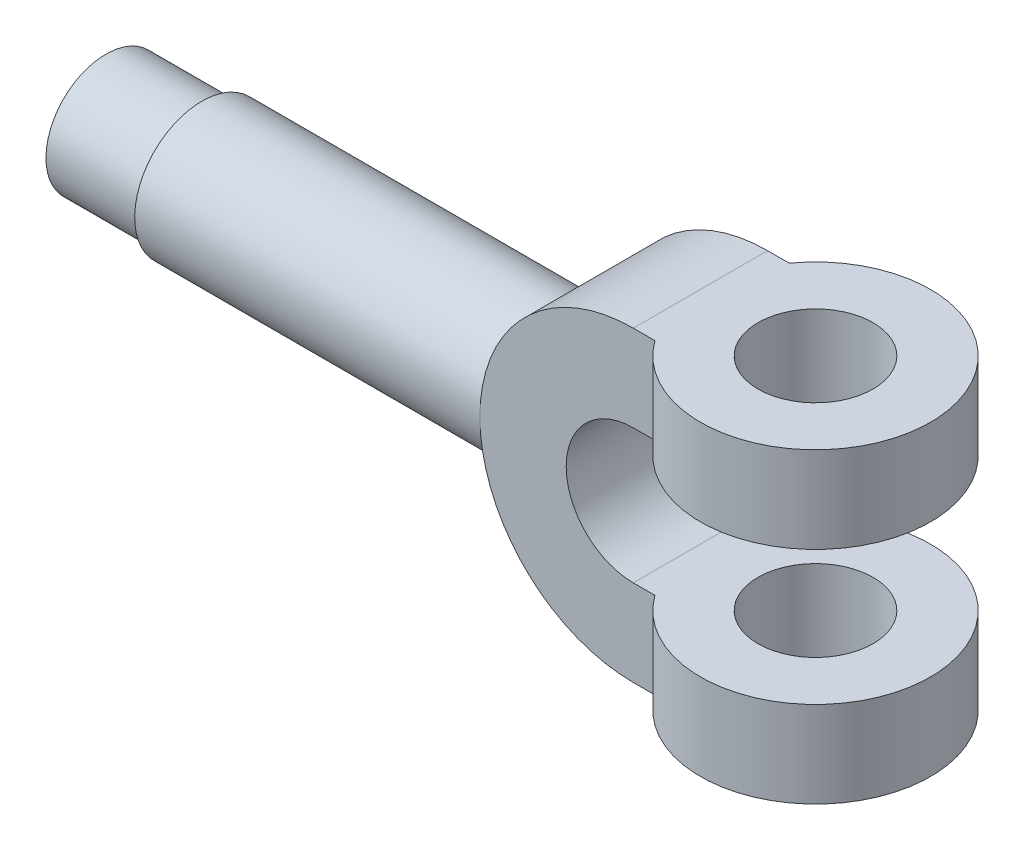
ISO-10303-21;
HEADER;
FILE_DESCRIPTION(('STEP AP214'),'2;1');
FILE_NAME('part.step','',(''),(''),'','','');
FILE_SCHEMA(('AUTOMOTIVE_DESIGN { 1 0 10303 214 1 1 1 1 }'));
ENDSEC;
DATA;
#1=APPLICATION_CONTEXT('core data for automotive mechanical design processes');
#2=APPLICATION_PROTOCOL_DEFINITION('international standard','automotive_design',2000,#1);
#3=PRODUCT_CONTEXT('',#1,'mechanical');
#4=PRODUCT('Part','Part','',(#3));
#5=PRODUCT_RELATED_PRODUCT_CATEGORY('part','',(#4));
#6=PRODUCT_DEFINITION_FORMATION('','',#4);
#7=PRODUCT_DEFINITION_CONTEXT('part definition',#1,'design');
#8=PRODUCT_DEFINITION('design','',#6,#7);
#9=PRODUCT_DEFINITION_SHAPE('','',#8);
#10=(LENGTH_UNIT() NAMED_UNIT(*) SI_UNIT(.MILLI.,.METRE.));
#11=(NAMED_UNIT(*) PLANE_ANGLE_UNIT() SI_UNIT($,.RADIAN.));
#12=(NAMED_UNIT(*) SI_UNIT($,.STERADIAN.) SOLID_ANGLE_UNIT());
#13=UNCERTAINTY_MEASURE_WITH_UNIT(LENGTH_MEASURE(1.E-05),#10,'distance_accuracy_value','');
#14=(GEOMETRIC_REPRESENTATION_CONTEXT(3) GLOBAL_UNCERTAINTY_ASSIGNED_CONTEXT((#13)) GLOBAL_UNIT_ASSIGNED_CONTEXT((#10,
#11,#12)) REPRESENTATION_CONTEXT('',''));
#15=CARTESIAN_POINT('',(0.,0.,0.));
#16=DIRECTION('',(0.,0.,1.));
#17=DIRECTION('',(1.,0.,0.));
#18=AXIS2_PLACEMENT_3D('',#15,#16,#17);
#19=CARTESIAN_POINT('',(0.,18.,0.));
#20=DIRECTION('',(0.,-1.,0.));
#21=DIRECTION('',(0.,0.,-1.));
#22=AXIS2_PLACEMENT_3D('',#19,#20,#21);
#23=CYLINDRICAL_SURFACE('',#22,24.);
#24=DIRECTION('',(0.,-1.,0.));
#25=VECTOR('',#24,1.);
#26=CARTESIAN_POINT('',(-19.4935886896179,18.,-14.));
#27=LINE('',#26,#25);
#28=CARTESIAN_POINT('',(-19.4935886896179,18.,-14.));
#29=VERTEX_POINT('',#28);
#30=CARTESIAN_POINT('',(-19.493588689618,0.,-13.9999999999999));
#31=VERTEX_POINT('',#30);
#32=EDGE_CURVE('E128',#29,#31,#27,.T.);
#33=ORIENTED_EDGE('',*,*,#32,.F.);
#34=CARTESIAN_POINT('',(0.,18.,0.));
#35=DIRECTION('',(0.,1.,0.));
#36=DIRECTION('',(0.,0.,1.));
#37=AXIS2_PLACEMENT_3D('',#34,#35,#36);
#38=CIRCLE('',#37,24.);
#39=CARTESIAN_POINT('',(-19.4935886896179,18.,14.));
#40=VERTEX_POINT('',#39);
#41=EDGE_CURVE('E13',#40,#29,#38,.T.);
#42=ORIENTED_EDGE('',*,*,#41,.F.);
#43=DIRECTION('',(0.,-1.,0.));
#44=VECTOR('',#43,1.);
#45=CARTESIAN_POINT('',(-19.4935886896179,18.,14.));
#46=LINE('',#45,#44);
#47=CARTESIAN_POINT('',(-19.493588689618,0.,14.0000000000001));
#48=VERTEX_POINT('',#47);
#49=EDGE_CURVE('E150',#40,#48,#46,.T.);
#50=ORIENTED_EDGE('',*,*,#49,.T.);
#51=CARTESIAN_POINT('',(0.,0.,0.));
#52=DIRECTION('',(0.,1.,0.));
#53=DIRECTION('',(0.,0.,1.));
#54=AXIS2_PLACEMENT_3D('',#51,#52,#53);
#55=CIRCLE('',#54,24.);
#56=EDGE_CURVE('E55',#48,#31,#55,.T.);
#57=ORIENTED_EDGE('',*,*,#56,.T.);
#58=EDGE_LOOP('',(#33,#42,#50,#57));
#59=FACE_BOUND('',#58,.T.);
#60=ADVANCED_FACE('F52',(#59),#23,.T.);
#61=CARTESIAN_POINT('',(0.,18.,0.));
#62=DIRECTION('',(0.,1.,0.));
#63=DIRECTION('',(0.,0.,1.));
#64=AXIS2_PLACEMENT_3D('',#61,#62,#63);
#65=PLANE('',#64);
#66=ORIENTED_EDGE('',*,*,#41,.T.);
#67=DIRECTION('',(-1.,0.,0.));
#68=VECTOR('',#67,1.);
#69=CARTESIAN_POINT('',(-24.0000000000001,18.,-14.));
#70=LINE('',#69,#68);
#71=CARTESIAN_POINT('',(-24.,18.,-13.9999999999999));
#72=VERTEX_POINT('',#71);
#73=EDGE_CURVE('E124',#29,#72,#70,.T.);
#74=ORIENTED_EDGE('',*,*,#73,.T.);
#75=DIRECTION('',(0.,0.,-1.));
#76=VECTOR('',#75,1.);
#77=CARTESIAN_POINT('',(-24.0000000000001,18.,14.0000000000001));
#78=LINE('',#77,#76);
#79=CARTESIAN_POINT('',(-24.,18.,14.0000000000001));
#80=VERTEX_POINT('',#79);
#81=EDGE_CURVE('E146',#80,#72,#78,.T.);
#82=ORIENTED_EDGE('',*,*,#81,.F.);
#83=DIRECTION('',(-1.,0.,0.));
#84=VECTOR('',#83,1.);
#85=CARTESIAN_POINT('',(-24.0000000000001,18.,14.0000000000001));
#86=LINE('',#85,#84);
#87=EDGE_CURVE('E145',#40,#80,#86,.T.);
#88=ORIENTED_EDGE('',*,*,#87,.F.);
#89=EDGE_LOOP('',(#66,#74,#82,#88));
#90=FACE_BOUND('',#89,.T.);
#91=CARTESIAN_POINT('',(0.,18.,0.));
#92=DIRECTION('',(0.,1.,0.));
#93=DIRECTION('',(0.,0.,1.));
#94=AXIS2_PLACEMENT_3D('',#91,#92,#93);
#95=CIRCLE('',#94,12.);
#96=CARTESIAN_POINT('',(0.,18.,12.));
#97=VERTEX_POINT('',#96);
#98=EDGE_CURVE('E167',#97,#97,#95,.T.);
#99=ORIENTED_EDGE('',*,*,#98,.F.);
#100=EDGE_LOOP('',(#99));
#101=FACE_BOUND('',#100,.T.);
#102=ADVANCED_FACE('F142',(#90,#101),#65,.T.);
#103=CARTESIAN_POINT('',(0.,0.,0.));
#104=DIRECTION('',(0.,1.,0.));
#105=DIRECTION('',(0.,0.,1.));
#106=AXIS2_PLACEMENT_3D('',#103,#104,#105);
#107=PLANE('',#106);
#108=ORIENTED_EDGE('',*,*,#56,.F.);
#109=DIRECTION('',(-1.,0.,0.));
#110=VECTOR('',#109,1.);
#111=CARTESIAN_POINT('',(-24.,0.,14.));
#112=LINE('',#111,#110);
#113=CARTESIAN_POINT('',(-24.,0.,14.));
#114=VERTEX_POINT('',#113);
#115=EDGE_CURVE('E157',#48,#114,#112,.T.);
#116=ORIENTED_EDGE('',*,*,#115,.T.);
#117=DIRECTION('',(0.,0.,-1.));
#118=VECTOR('',#117,1.);
#119=CARTESIAN_POINT('',(-24.,0.,14.));
#120=LINE('',#119,#118);
#121=CARTESIAN_POINT('',(-24.,0.,-14.));
#122=VERTEX_POINT('',#121);
#123=EDGE_CURVE('E73',#114,#122,#120,.T.);
#124=ORIENTED_EDGE('',*,*,#123,.T.);
#125=DIRECTION('',(-1.,0.,0.));
#126=VECTOR('',#125,1.);
#127=CARTESIAN_POINT('',(-24.,0.,-14.));
#128=LINE('',#127,#126);
#129=EDGE_CURVE('E135',#31,#122,#128,.T.);
#130=ORIENTED_EDGE('',*,*,#129,.F.);
#131=EDGE_LOOP('',(#108,#116,#124,#130));
#132=FACE_BOUND('',#131,.T.);
#133=CARTESIAN_POINT('',(0.,0.,0.));
#134=DIRECTION('',(0.,1.,0.));
#135=DIRECTION('',(0.,0.,1.));
#136=AXIS2_PLACEMENT_3D('',#133,#134,#135);
#137=CIRCLE('',#136,12.);
#138=CARTESIAN_POINT('',(0.,0.,12.));
#139=VERTEX_POINT('',#138);
#140=EDGE_CURVE('E155',#139,#139,#137,.T.);
#141=ORIENTED_EDGE('',*,*,#140,.T.);
#142=EDGE_LOOP('',(#141));
#143=FACE_BOUND('',#142,.T.);
#144=ADVANCED_FACE('F176',(#132,#143),#107,.F.);
#145=CARTESIAN_POINT('',(0.,18.,0.));
#146=DIRECTION('',(0.,-1.,0.));
#147=DIRECTION('',(0.,0.,-1.));
#148=AXIS2_PLACEMENT_3D('',#145,#146,#147);
#149=CYLINDRICAL_SURFACE('',#148,12.);
#150=ORIENTED_EDGE('',*,*,#98,.T.);
#151=EDGE_LOOP('',(#150));
#152=FACE_BOUND('',#151,.T.);
#153=ORIENTED_EDGE('',*,*,#140,.F.);
#154=EDGE_LOOP('',(#153));
#155=FACE_BOUND('',#154,.T.);
#156=ADVANCED_FACE('F178',(#152,#155),#149,.F.);
#157=CARTESIAN_POINT('',(-24.0000000000001,18.,14.0000000000001));
#158=DIRECTION('',(0.,0.,1.));
#159=DIRECTION('',(1.,0.,0.));
#160=AXIS2_PLACEMENT_3D('',#157,#158,#159);
#161=PLANE('',#160);
#162=ORIENTED_EDGE('',*,*,#115,.F.);
#163=ORIENTED_EDGE('',*,*,#49,.F.);
#164=ORIENTED_EDGE('',*,*,#87,.T.);
#165=CARTESIAN_POINT('',(-24.,31.9999999999999,14.));
#166=DIRECTION('',(0.,0.,1.));
#167=DIRECTION('',(1.,0.,0.));
#168=AXIS2_PLACEMENT_3D('',#165,#166,#167);
#169=CIRCLE('',#168,14.);
#170=CARTESIAN_POINT('',(-24.,46.,14.));
#171=VERTEX_POINT('',#170);
#172=EDGE_CURVE('E373',#171,#80,#169,.T.);
#173=ORIENTED_EDGE('',*,*,#172,.F.);
#174=DIRECTION('',(1.,0.,0.));
#175=VECTOR('',#174,1.);
#176=CARTESIAN_POINT('',(-24.,46.,14.));
#177=LINE('',#176,#175);
#178=CARTESIAN_POINT('',(-19.493588689618,46.,14.));
#179=VERTEX_POINT('',#178);
#180=EDGE_CURVE('E435',#171,#179,#177,.T.);
#181=ORIENTED_EDGE('',*,*,#180,.T.);
#182=DIRECTION('',(0.,1.,0.));
#183=VECTOR('',#182,1.);
#184=CARTESIAN_POINT('',(-19.493588689618,46.,14.));
#185=LINE('',#184,#183);
#186=CARTESIAN_POINT('',(-19.493588689618,63.9999999999999,14.));
#187=VERTEX_POINT('',#186);
#188=EDGE_CURVE('E422',#179,#187,#185,.T.);
#189=ORIENTED_EDGE('',*,*,#188,.T.);
#190=DIRECTION('',(1.,0.,0.));
#191=VECTOR('',#190,1.);
#192=CARTESIAN_POINT('',(-24.,64.,14.));
#193=LINE('',#192,#191);
#194=CARTESIAN_POINT('',(-24.,64.,14.));
#195=VERTEX_POINT('',#194);
#196=EDGE_CURVE('E139',#195,#187,#193,.T.);
#197=ORIENTED_EDGE('',*,*,#196,.F.);
#198=CARTESIAN_POINT('',(-24.,31.9999999999999,14.));
#199=DIRECTION('',(0.,0.,1.));
#200=DIRECTION('',(1.,0.,0.));
#201=AXIS2_PLACEMENT_3D('',#198,#199,#200);
#202=CIRCLE('',#201,32.);
#203=CARTESIAN_POINT('',(-56.,32.,14.0000000000001));
#204=VERTEX_POINT('',#203);
#205=EDGE_CURVE('E379',#195,#204,#202,.T.);
#206=ORIENTED_EDGE('',*,*,#205,.T.);
#207=EDGE_CURVE('E377',#204,#114,#202,.T.);
#208=ORIENTED_EDGE('',*,*,#207,.T.);
#209=EDGE_LOOP('',(#162,#163,#164,#173,#181,#189,#197,#206,#208));
#210=FACE_BOUND('',#209,.T.);
#211=ADVANCED_FACE('F180',(#210),#161,.T.);
#212=CARTESIAN_POINT('',(0.,64.,0.));
#213=DIRECTION('',(0.,-1.,0.));
#214=DIRECTION('',(0.,0.,-1.));
#215=AXIS2_PLACEMENT_3D('',#212,#213,#214);
#216=CYLINDRICAL_SURFACE('',#215,24.);
#217=CARTESIAN_POINT('',(0.,64.,0.));
#218=DIRECTION('',(0.,1.,0.));
#219=DIRECTION('',(0.,0.,1.));
#220=AXIS2_PLACEMENT_3D('',#217,#218,#219);
#221=CIRCLE('',#220,24.);
#222=CARTESIAN_POINT('',(-19.4935886896179,63.9999999999999,-14.));
#223=VERTEX_POINT('',#222);
#224=EDGE_CURVE('E163',#187,#223,#221,.T.);
#225=ORIENTED_EDGE('',*,*,#224,.F.);
#226=ORIENTED_EDGE('',*,*,#188,.F.);
#227=CARTESIAN_POINT('',(0.,46.,0.));
#228=DIRECTION('',(0.,1.,0.));
#229=DIRECTION('',(0.,0.,1.));
#230=AXIS2_PLACEMENT_3D('',#227,#228,#229);
#231=CIRCLE('',#230,24.);
#232=CARTESIAN_POINT('',(-19.4935886896179,46.,-14.));
#233=VERTEX_POINT('',#232);
#234=EDGE_CURVE('E412',#179,#233,#231,.T.);
#235=ORIENTED_EDGE('',*,*,#234,.T.);
#236=DIRECTION('',(0.,1.,0.));
#237=VECTOR('',#236,1.);
#238=CARTESIAN_POINT('',(-19.4935886896179,46.,-14.));
#239=LINE('',#238,#237);
#240=EDGE_CURVE('E398',#233,#223,#239,.T.);
#241=ORIENTED_EDGE('',*,*,#240,.T.);
#242=EDGE_LOOP('',(#225,#226,#235,#241));
#243=FACE_BOUND('',#242,.T.);
#244=ADVANCED_FACE('F187',(#243),#216,.T.);
#245=CARTESIAN_POINT('',(0.,64.,0.));
#246=DIRECTION('',(0.,1.,0.));
#247=DIRECTION('',(0.,0.,1.));
#248=AXIS2_PLACEMENT_3D('',#245,#246,#247);
#249=PLANE('',#248);
#250=DIRECTION('',(0.,0.,1.));
#251=VECTOR('',#250,1.);
#252=CARTESIAN_POINT('',(-24.,64.,-14.));
#253=LINE('',#252,#251);
#254=CARTESIAN_POINT('',(-24.,64.,-14.));
#255=VERTEX_POINT('',#254);
#256=EDGE_CURVE('E395',#255,#195,#253,.T.);
#257=ORIENTED_EDGE('',*,*,#256,.T.);
#258=ORIENTED_EDGE('',*,*,#196,.T.);
#259=ORIENTED_EDGE('',*,*,#224,.T.);
#260=DIRECTION('',(1.,0.,0.));
#261=VECTOR('',#260,1.);
#262=CARTESIAN_POINT('',(-24.,64.,-14.));
#263=LINE('',#262,#261);
#264=EDGE_CURVE('E399',#255,#223,#263,.T.);
#265=ORIENTED_EDGE('',*,*,#264,.F.);
#266=EDGE_LOOP('',(#257,#258,#259,#265));
#267=FACE_BOUND('',#266,.T.);
#268=CARTESIAN_POINT('',(0.,64.,0.));
#269=DIRECTION('',(0.,1.,0.));
#270=DIRECTION('',(0.,0.,1.));
#271=AXIS2_PLACEMENT_3D('',#268,#269,#270);
#272=CIRCLE('',#271,12.);
#273=CARTESIAN_POINT('',(0.,64.,11.9999999999999));
#274=VERTEX_POINT('',#273);
#275=EDGE_CURVE('E408',#274,#274,#272,.T.);
#276=ORIENTED_EDGE('',*,*,#275,.F.);
#277=EDGE_LOOP('',(#276));
#278=FACE_BOUND('',#277,.T.);
#279=ADVANCED_FACE('F225',(#267,#278),#249,.T.);
#280=CARTESIAN_POINT('',(0.,46.,0.));
#281=DIRECTION('',(0.,1.,0.));
#282=DIRECTION('',(0.,0.,1.));
#283=AXIS2_PLACEMENT_3D('',#280,#281,#282);
#284=PLANE('',#283);
#285=ORIENTED_EDGE('',*,*,#234,.F.);
#286=ORIENTED_EDGE('',*,*,#180,.F.);
#287=DIRECTION('',(0.,0.,1.));
#288=VECTOR('',#287,1.);
#289=CARTESIAN_POINT('',(-24.,46.,-14.));
#290=LINE('',#289,#288);
#291=CARTESIAN_POINT('',(-24.,46.,-14.));
#292=VERTEX_POINT('',#291);
#293=EDGE_CURVE('E394',#292,#171,#290,.T.);
#294=ORIENTED_EDGE('',*,*,#293,.F.);
#295=DIRECTION('',(1.,0.,0.));
#296=VECTOR('',#295,1.);
#297=CARTESIAN_POINT('',(-24.,46.,-14.));
#298=LINE('',#297,#296);
#299=EDGE_CURVE('E390',#292,#233,#298,.T.);
#300=ORIENTED_EDGE('',*,*,#299,.T.);
#301=EDGE_LOOP('',(#285,#286,#294,#300));
#302=FACE_BOUND('',#301,.T.);
#303=CARTESIAN_POINT('',(0.,46.,0.));
#304=DIRECTION('',(0.,1.,0.));
#305=DIRECTION('',(0.,0.,1.));
#306=AXIS2_PLACEMENT_3D('',#303,#304,#305);
#307=CIRCLE('',#306,12.);
#308=CARTESIAN_POINT('',(0.,46.,12.));
#309=VERTEX_POINT('',#308);
#310=EDGE_CURVE('E407',#309,#309,#307,.T.);
#311=ORIENTED_EDGE('',*,*,#310,.T.);
#312=EDGE_LOOP('',(#311));
#313=FACE_BOUND('',#312,.T.);
#314=ADVANCED_FACE('F235',(#302,#313),#284,.F.);
#315=CARTESIAN_POINT('',(0.,64.,0.));
#316=DIRECTION('',(0.,-1.,0.));
#317=DIRECTION('',(0.,0.,-1.));
#318=AXIS2_PLACEMENT_3D('',#315,#316,#317);
#319=CYLINDRICAL_SURFACE('',#318,12.);
#320=ORIENTED_EDGE('',*,*,#275,.T.);
#321=EDGE_LOOP('',(#320));
#322=FACE_BOUND('',#321,.T.);
#323=ORIENTED_EDGE('',*,*,#310,.F.);
#324=EDGE_LOOP('',(#323));
#325=FACE_BOUND('',#324,.T.);
#326=ADVANCED_FACE('F246',(#322,#325),#319,.F.);
#327=CARTESIAN_POINT('',(-24.,46.,-14.));
#328=DIRECTION('',(0.,0.,1.));
#329=DIRECTION('',(1.,0.,0.));
#330=AXIS2_PLACEMENT_3D('',#327,#328,#329);
#331=PLANE('',#330);
#332=ORIENTED_EDGE('',*,*,#264,.T.);
#333=ORIENTED_EDGE('',*,*,#240,.F.);
#334=ORIENTED_EDGE('',*,*,#299,.F.);
#335=CARTESIAN_POINT('',(-24.,32.,-14.));
#336=DIRECTION('',(0.,0.,1.));
#337=DIRECTION('',(1.,0.,0.));
#338=AXIS2_PLACEMENT_3D('',#335,#336,#337);
#339=CIRCLE('',#338,14.);
#340=EDGE_CURVE('E131',#292,#72,#339,.T.);
#341=ORIENTED_EDGE('',*,*,#340,.T.);
#342=ORIENTED_EDGE('',*,*,#73,.F.);
#343=ORIENTED_EDGE('',*,*,#32,.T.);
#344=ORIENTED_EDGE('',*,*,#129,.T.);
#345=CARTESIAN_POINT('',(-24.,32.,-14.));
#346=DIRECTION('',(0.,0.,1.));
#347=DIRECTION('',(1.,0.,0.));
#348=AXIS2_PLACEMENT_3D('',#345,#346,#347);
#349=CIRCLE('',#348,32.);
#350=CARTESIAN_POINT('',(-56.,32.,-13.9999999999999));
#351=VERTEX_POINT('',#350);
#352=EDGE_CURVE('E386',#351,#122,#349,.T.);
#353=ORIENTED_EDGE('',*,*,#352,.F.);
#354=EDGE_CURVE('E378',#255,#351,#349,.T.);
#355=ORIENTED_EDGE('',*,*,#354,.F.);
#356=EDGE_LOOP('',(#332,#333,#334,#341,#342,#343,#344,#353,#355));
#357=FACE_BOUND('',#356,.T.);
#358=ADVANCED_FACE('F126',(#357),#331,.F.);
#359=CARTESIAN_POINT('',(-24.,31.9999999999999,14.));
#360=DIRECTION('',(0.,0.,-1.));
#361=DIRECTION('',(-1.,0.,0.));
#362=AXIS2_PLACEMENT_3D('',#359,#360,#361);
#363=CYLINDRICAL_SURFACE('',#362,32.);
#364=ORIENTED_EDGE('',*,*,#354,.T.);
#365=CARTESIAN_POINT('',(-56.,32.,14.0000000000001));
#366=CARTESIAN_POINT('',(-55.9999977091615,32.3734661894903,13.9999972311943));
#367=CARTESIAN_POINT('',(-55.9934446265941,32.747035495716,13.9850363339566));
#368=CARTESIAN_POINT('',(-55.9673948940621,33.4914925823365,13.9253379408936));
#369=CARTESIAN_POINT('',(-55.9478906463527,33.8623786594418,13.8805829664628));
#370=CARTESIAN_POINT('',(-55.8963950483159,34.5993681634103,13.761645885035));
#371=CARTESIAN_POINT('',(-55.864376330547,34.9654592784149,13.6873992780213));
#372=CARTESIAN_POINT('',(-55.7886957269451,35.6893448238235,13.5102767689989));
#373=CARTESIAN_POINT('',(-55.7450354907118,36.0471404218981,13.4074049230879));
#374=CARTESIAN_POINT('',(-55.6473542811609,36.7508661977204,13.1744513172375));
#375=CARTESIAN_POINT('',(-55.5933703422525,37.0968337292326,13.0444666727374));
#376=CARTESIAN_POINT('',(-55.4762653403301,37.7761168761983,12.7582259218887));
#377=CARTESIAN_POINT('',(-55.4131439823884,38.1094320828353,12.601968967525));
#378=CARTESIAN_POINT('',(-55.2793017136698,38.7613585965969,12.264529525754));
#379=CARTESIAN_POINT('',(-55.2085848068745,39.0799775254413,12.0833601569069));
#380=CARTESIAN_POINT('',(-55.0611325370282,39.7011693157725,11.6972558588455));
#381=CARTESIAN_POINT('',(-54.9843948210029,40.0037358256528,11.492311623123));
#382=CARTESIAN_POINT('',(-54.8227700304631,40.6057373268499,11.0493326284155));
#383=CARTESIAN_POINT('',(-54.7376676628612,40.9042802675363,10.8101637313014));
#384=CARTESIAN_POINT('',(-54.5648883045155,41.4804044421041,10.3086280932423));
#385=CARTESIAN_POINT('',(-54.4772112060417,41.7579847971433,10.0462603807027));
#386=CARTESIAN_POINT('',(-54.3014330142179,42.2908657136913,9.49967508522412));
#387=CARTESIAN_POINT('',(-54.2133317417171,42.5461557924335,9.21544733877774));
#388=CARTESIAN_POINT('',(-54.0389872889653,43.0329556682599,8.62669234717267));
#389=CARTESIAN_POINT('',(-53.9527444229386,43.2644614683845,8.32216170423484));
#390=CARTESIAN_POINT('',(-53.7797262134454,43.7144881223919,7.67684857725172));
#391=CARTESIAN_POINT('',(-53.6931897532426,43.9315633076208,7.33499142276398));
#392=CARTESIAN_POINT('',(-53.527514569434,44.3358671193258,6.63253593565465));
#393=CARTESIAN_POINT('',(-53.4483727671703,44.5231081899062,6.27194550053428));
#394=CARTESIAN_POINT('',(-53.3001168976382,44.8661604523834,5.53419857055157));
#395=CARTESIAN_POINT('',(-53.2310007195932,45.0219782627801,5.15704558458562));
#396=CARTESIAN_POINT('',(-53.1052791604821,45.300606142229,4.38871526763876));
#397=CARTESIAN_POINT('',(-53.0486727399857,45.4234189538354,3.99753910497883));
#398=CARTESIAN_POINT('',(-52.9526980290422,45.6291414425305,3.22460893002658));
#399=CARTESIAN_POINT('',(-52.9125922222566,45.7137801308539,2.84340686829827));
#400=CARTESIAN_POINT('',(-52.847091891541,45.8510324222528,2.07402222768933));
#401=CARTESIAN_POINT('',(-52.8216968724371,45.9036471032787,1.68583988422275));
#402=CARTESIAN_POINT('',(-52.7866123397468,45.9761432421288,0.90593370531743));
#403=CARTESIAN_POINT('',(-52.776914250688,45.9960425729419,0.514211921239048));
#404=CARTESIAN_POINT('',(-52.7735839804415,46.0028887174275,-0.269576273526991));
#405=CARTESIAN_POINT('',(-52.7799508170086,45.9898375457671,-0.661642661679589));
#406=CARTESIAN_POINT('',(-52.8072556772794,45.9335158603546,-1.4089777782355));
#407=CARTESIAN_POINT('',(-52.8268888589196,45.8929503326553,-1.76450229289653));
#408=CARTESIAN_POINT('',(-52.8787013318817,45.7849264055886,-2.4704875848003));
#409=CARTESIAN_POINT('',(-52.9108797867063,45.7174697992655,-2.82094869804651));
#410=CARTESIAN_POINT('',(-52.9867770873733,45.556351504055,-3.51456008360468));
#411=CARTESIAN_POINT('',(-53.0304977694622,45.4626856454101,-3.85770918325672));
#412=CARTESIAN_POINT('',(-53.1281679385108,45.250037972216,-4.53457280256343));
#413=CARTESIAN_POINT('',(-53.1821178604552,45.1310550810677,-4.86828692031438));
#414=CARTESIAN_POINT('',(-53.3000019090419,44.865900059415,-5.53163537568543));
#415=CARTESIAN_POINT('',(-53.3641291278409,44.719188647283,-5.86101954485889));
#416=CARTESIAN_POINT('',(-53.4997239898682,44.4014561720417,-6.50640556659794));
#417=CARTESIAN_POINT('',(-53.5711942929695,44.2304262914213,-6.82240251097875));
#418=CARTESIAN_POINT('',(-53.7196130106879,43.8652199808343,-7.43942874330684));
#419=CARTESIAN_POINT('',(-53.7965622282273,43.671040155473,-7.7404558264314));
#420=CARTESIAN_POINT('',(-53.9540502171687,43.2606914059406,-8.32614579299197));
#421=CARTESIAN_POINT('',(-54.0345892105684,43.0445211207797,-8.61080766187625));
#422=CARTESIAN_POINT('',(-54.2050687810019,42.5699212217268,-9.1885466931015));
#423=CARTESIAN_POINT('',(-54.295179234468,42.3094287181404,-9.47988215101358));
#424=CARTESIAN_POINT('',(-54.4750006671676,41.7650634233959,-10.0397173652309));
#425=CARTESIAN_POINT('',(-54.5647117850793,41.4811995465229,-10.308225749515));
#426=CARTESIAN_POINT('',(-54.741489742762,40.891324894679,-10.8211458862086));
#427=CARTESIAN_POINT('',(-54.8285546658466,40.5852985853805,-11.0655404474202));
#428=CARTESIAN_POINT('',(-54.997674523038,39.953062406907,-11.5283218987205));
#429=CARTESIAN_POINT('',(-55.0797314817211,39.626860802856,-11.7467193330969));
#430=CARTESIAN_POINT('',(-55.2389339232817,38.9465408000107,-12.1617746989452));
#431=CARTESIAN_POINT('',(-55.3158762804563,38.5918951894993,-12.3576481578832));
#432=CARTESIAN_POINT('',(-55.4600544634157,37.8653324009263,-12.7185852267346));
#433=CARTESIAN_POINT('',(-55.5272899981067,37.4934147053413,-12.8836479127202));
#434=CARTESIAN_POINT('',(-55.6500586556778,36.7351050866098,-13.1812208365546));
#435=CARTESIAN_POINT('',(-55.7055975353259,36.3487203945247,-13.3137470932765));
#436=CARTESIAN_POINT('',(-55.8033333086053,35.5642880770578,-13.5448511005102));
#437=CARTESIAN_POINT('',(-55.8455313347372,35.1662414447906,-13.6434317327179));
#438=CARTESIAN_POINT('',(-55.9128944664278,34.3892868084905,-13.7999078602613));
#439=CARTESIAN_POINT('',(-55.9390260372097,34.0109283732795,-13.8601222002682));
#440=CARTESIAN_POINT('',(-55.977851272322,33.2498683087316,-13.9493582875205));
#441=CARTESIAN_POINT('',(-55.990545546101,32.8671668771671,-13.9783814494427));
#442=CARTESIAN_POINT('',(-56.0021374656372,32.1005732593341,-14.0048899646856));
#443=CARTESIAN_POINT('',(-56.0010389707485,31.716681436205,-14.0023841401303));
#444=CARTESIAN_POINT('',(-55.9850853540906,30.9506918767547,-13.9658854901771));
#445=CARTESIAN_POINT('',(-55.9702305985151,30.568594092948,-13.9318935029456));
#446=CARTESIAN_POINT('',(-55.9283920425118,29.8305070377075,-13.8356051981835));
#447=CARTESIAN_POINT('',(-55.9021341240605,29.4742540340771,-13.775000687206));
#448=CARTESIAN_POINT('',(-55.8383854919596,28.7684758593278,-13.6267116848382));
#449=CARTESIAN_POINT('',(-55.8008953016868,28.4189503755419,-13.5390284551971));
#450=CARTESIAN_POINT('',(-55.7155809914261,27.7288372383053,-13.3374065884492));
#451=CARTESIAN_POINT('',(-55.667756153789,27.3882502073932,-13.2234661279754));
#452=CARTESIAN_POINT('',(-55.5628925028809,26.718061377336,-12.9703295027186));
#453=CARTESIAN_POINT('',(-55.5058533382073,26.3884599977242,-12.8311323747087));
#454=CARTESIAN_POINT('',(-55.3819520375534,25.7319760145314,-12.52386878014));
#455=CARTESIAN_POINT('',(-55.3148389228255,25.4054991815149,-12.3550370056946));
#456=CARTESIAN_POINT('',(-55.1737674079104,24.7679293402385,-11.9929797750896));
#457=CARTESIAN_POINT('',(-55.0998089203772,24.4568365283542,-11.7997540076548));
#458=CARTESIAN_POINT('',(-54.946727204558,23.8515301940985,-11.3901715009278));
#459=CARTESIAN_POINT('',(-54.867602957906,23.557320021543,-11.1738101953525));
#460=CARTESIAN_POINT('',(-54.7059657900296,22.9871469969567,-10.7192108012521));
#461=CARTESIAN_POINT('',(-54.6234516610909,22.711190741265,-10.4809648778645));
#462=CARTESIAN_POINT('',(-54.4504080024214,22.1580972864836,-9.96449106759695));
#463=CARTESIAN_POINT('',(-54.3597562432853,21.882555115248,-9.68459353261606));
#464=CARTESIAN_POINT('',(-54.1791195273096,21.3558331833924,-9.10251586622371));
#465=CARTESIAN_POINT('',(-54.0891346165553,21.1046550923088,-8.80033421029805));
#466=CARTESIAN_POINT('',(-53.9122635786899,20.6280546674036,-8.17517124277036));
#467=CARTESIAN_POINT('',(-53.8253790929527,20.4026458407381,-7.85217916064734));
#468=CARTESIAN_POINT('',(-53.6573020827527,19.9793389981407,-7.18741391485836));
#469=CARTESIAN_POINT('',(-53.5761073109608,19.7814300895546,-6.84564826263831));
#470=CARTESIAN_POINT('',(-53.420218856719,19.4106373536881,-6.13766997297217));
#471=CARTESIAN_POINT('',(-53.3457005061684,19.2383764219504,-5.77109164911674));
#472=CARTESIAN_POINT('',(-53.2077197640025,18.9256607612918,-5.02256506816));
#473=CARTESIAN_POINT('',(-53.1442576318517,18.7852067787847,-4.6406164506116));
#474=CARTESIAN_POINT('',(-53.0307825597378,18.5377488071204,-3.86439980170661));
#475=CARTESIAN_POINT('',(-52.980759091804,18.4307186227177,-3.47014168561299));
#476=CARTESIAN_POINT('',(-52.896079427728,18.251309947935,-2.67220615510285));
#477=CARTESIAN_POINT('',(-52.8614215709921,18.1789277130113,-2.26852976350487));
#478=CARTESIAN_POINT('',(-52.811087902049,18.0743304793107,-1.4890587630674));
#479=CARTESIAN_POINT('',(-52.7940761526381,18.0392819744875,-1.11372848564576));
#480=CARTESIAN_POINT('',(-52.7747964804482,17.9995860067745,-0.361092260636842));
#481=CARTESIAN_POINT('',(-52.7725277073156,17.9949367904978,0.0162135717469476));
#482=CARTESIAN_POINT('',(-52.7828165429481,18.0160948784555,0.769694669662507));
#483=CARTESIAN_POINT('',(-52.7953715813737,18.0418969026692,1.14587011985707));
#484=CARTESIAN_POINT('',(-52.8348444454506,18.1236244650154,1.89416265420247));
#485=CARTESIAN_POINT('',(-52.8617620772518,18.1795495965798,2.2662797930587));
#486=CARTESIAN_POINT('',(-52.9270851226547,18.3168294883056,2.98265231870005));
#487=CARTESIAN_POINT('',(-52.9647506093788,18.3965581544332,3.32728914048858));
#488=CARTESIAN_POINT('',(-53.0508716123182,18.5814586050476,4.0084059025778));
#489=CARTESIAN_POINT('',(-53.0993308190417,18.6866390928965,4.34488300923204));
#490=CARTESIAN_POINT('',(-53.2056390067505,18.9214967491749,5.00763035742678));
#491=CARTESIAN_POINT('',(-53.2634879974676,19.0511739429934,5.33390058838818));
#492=CARTESIAN_POINT('',(-53.3870149940309,19.3340159101841,5.97456973899046));
#493=CARTESIAN_POINT('',(-53.4526936217124,19.487182549382,6.28896771311363));
#494=CARTESIAN_POINT('',(-53.5945587568395,19.8263411556737,6.92384325286678));
#495=CARTESIAN_POINT('',(-53.6711469777666,20.0137956043825,7.24345000430809));
#496=CARTESIAN_POINT('',(-53.8292266423737,20.4127969400714,7.86596629599358));
#497=CARTESIAN_POINT('',(-53.9107182380583,20.6243445741219,8.1688753180498));
#498=CARTESIAN_POINT('',(-54.0765562768519,21.0703444826824,8.75664103266347));
#499=CARTESIAN_POINT('',(-54.1609035294273,21.3048032877416,9.04149253977706));
#500=CARTESIAN_POINT('',(-54.3303904713912,21.7953558011633,9.59172108257304));
#501=CARTESIAN_POINT('',(-54.415530268612,22.0514524929915,9.85709542325598));
#502=CARTESIAN_POINT('',(-54.5916867612396,22.6063652240774,10.3884211014644));
#503=CARTESIAN_POINT('',(-54.6825969214783,22.9069626891407,10.6525513077592));
#504=CARTESIAN_POINT('',(-54.8604692922195,23.5302641517313,11.1545346731627));
#505=CARTESIAN_POINT('',(-54.9474328646171,23.8529604254228,11.3923969381005));
#506=CARTESIAN_POINT('',(-55.1151412054529,24.5189590836947,11.8404053086651));
#507=CARTESIAN_POINT('',(-55.1958813635475,24.8622764157829,12.0505309473923));
#508=CARTESIAN_POINT('',(-55.3488281421578,25.5671925388687,12.441114304629));
#509=CARTESIAN_POINT('',(-55.4210354292839,25.9287898986268,12.6215743411251));
#510=CARTESIAN_POINT('',(-55.5540108543001,26.663161668616,12.9490427412948));
#511=CARTESIAN_POINT('',(-55.6149136851337,27.0357335505221,13.0964500272775));
#512=CARTESIAN_POINT('',(-55.7246715397772,27.7938278816646,13.3592309593926));
#513=CARTESIAN_POINT('',(-55.7735246345268,28.1793523932965,13.4745994767624));
#514=CARTESIAN_POINT('',(-55.8576060626244,28.9592186563808,13.6716856069835));
#515=CARTESIAN_POINT('',(-55.8928715062215,29.3535332353891,13.75349491604));
#516=CARTESIAN_POINT('',(-55.9488768501936,30.1485598008319,13.8828730283391));
#517=CARTESIAN_POINT('',(-55.9696269861437,30.5492670750597,13.9304659601685));
#518=CARTESIAN_POINT('',(-55.9885336038657,31.1257852154652,13.9737747386223));
#519=CARTESIAN_POINT('',(-55.9928303781471,31.3004461199483,13.9836056977057));
#520=CARTESIAN_POINT('',(-55.9985641259361,31.6500638024814,13.9967190069337));
#521=CARTESIAN_POINT('',(-56.0000010733224,31.8250205832193,14.0000012972635));
#522=CARTESIAN_POINT('',(-56.,32.,14.0000000000001));
#523=B_SPLINE_CURVE_WITH_KNOTS('',3,(#365,#366,#367,#368,#369,#370,#371,#372,#373,#374,#375,
#376,#377,#378,#379,#380,#381,#382,#383,#384,#385,#386,#387,#388,#389,#390,#391,#392,#393,#394,
#395,#396,#397,#398,#399,#400,#401,#402,#403,#404,#405,#406,#407,#408,#409,#410,#411,#412,#413,
#414,#415,#416,#417,#418,#419,#420,#421,#422,#423,#424,#425,#426,#427,#428,#429,#430,#431,#432,
#433,#434,#435,#436,#437,#438,#439,#440,#441,#442,#443,#444,#445,#446,#447,#448,#449,#450,#451,
#452,#453,#454,#455,#456,#457,#458,#459,#460,#461,#462,#463,#464,#465,#466,#467,#468,#469,#470,
#471,#472,#473,#474,#475,#476,#477,#478,#479,#480,#481,#482,#483,#484,#485,#486,#487,#488,#489,
#490,#491,#492,#493,#494,#495,#496,#497,#498,#499,#500,#501,#502,#503,#504,#505,#506,#507,#508,
#509,#510,#511,#512,#513,#514,#515,#516,#517,#518,#519,#520,#521,#522),.UNSPECIFIED.,.T.,.F.,(4,
2,2,2,2,2,2,2,2,2,2,2,2,2,2,2,2,2,2,2,2,2,2,2,2,2,2,2,2,2,2,2,2,2,2,2,2,2,2,2,2,2,2,2,2,2,2,2,2,
2,2,2,2,2,2,2,2,2,2,2,2,2,2,2,2,2,2,2,2,2,2,2,2,2,2,2,2,2,4),(0.,1.12022233987352,
2.24110243460994,3.36444758125288,4.4876336347452,5.60686358370257,6.72612966599849,
7.84480859813269,8.96392691652,10.1382951869482,11.3127126646643,12.4876795106218,
13.6628434884624,14.9035901806965,16.1438179827067,17.3837842892382,18.6236475287423,
19.7996700902674,20.9756530638624,22.150993362888,23.3262618007341,24.4001097933026,
25.4738861957727,26.5478335277841,27.6218265382183,28.7193841163656,29.817340672036,
30.9154584632045,32.0136442582842,33.2154838609511,34.4168671641577,35.6191008596927,
36.8208452624571,38.0563990829489,39.2919899482453,40.5269712615617,41.761847709562,
42.9123858331806,44.0628717719074,45.2130358003906,46.3631692122171,47.4488892366134,
48.5345586788598,49.6203035354086,50.706089808293,51.8257571628751,52.9454388062221,
54.0653418515438,55.1856474051669,56.3935565534755,57.6015484147645,58.810170578917,
60.0183126375516,61.2521907226753,62.4860977602214,63.7190353061861,64.9518395735168,
66.0823969798042,67.2128891765998,68.3431853831711,69.4734663346471,70.539502407185,
71.6059035318551,72.6723057617792,73.7387927426285,74.872658357845,76.0065591410222,
77.1407840767837,78.2751656572676,79.5047609592396,80.7339286728771,81.9639983805295,
83.1939719282707,84.4081886970312,85.6225997255871,86.8336700684539,88.0438855530036,
88.5687364413861,89.0935921236721),.UNSPECIFIED.);
#524=EDGE_CURVE('E370',#204,#351,#523,.T.);
#525=ORIENTED_EDGE('',*,*,#524,.F.);
#526=ORIENTED_EDGE('',*,*,#205,.F.);
#527=ORIENTED_EDGE('',*,*,#256,.F.);
#528=EDGE_LOOP('',(#364,#525,#526,#527));
#529=FACE_BOUND('',#528,.T.);
#530=ADVANCED_FACE('F268',(#529),#363,.T.);
#531=EDGE_CURVE('E363',#351,#204,#523,.T.);
#532=ORIENTED_EDGE('',*,*,#531,.F.);
#533=ORIENTED_EDGE('',*,*,#352,.T.);
#534=ORIENTED_EDGE('',*,*,#123,.F.);
#535=ORIENTED_EDGE('',*,*,#207,.F.);
#536=EDGE_LOOP('',(#532,#533,#534,#535));
#537=FACE_BOUND('',#536,.T.);
#538=ADVANCED_FACE('F277',(#537),#363,.T.);
#539=CARTESIAN_POINT('',(-24.,31.9999999999999,14.));
#540=DIRECTION('',(0.,0.,-1.));
#541=DIRECTION('',(-1.,0.,0.));
#542=AXIS2_PLACEMENT_3D('',#539,#540,#541);
#543=CYLINDRICAL_SURFACE('',#542,14.);
#544=ORIENTED_EDGE('',*,*,#340,.F.);
#545=ORIENTED_EDGE('',*,*,#293,.T.);
#546=ORIENTED_EDGE('',*,*,#172,.T.);
#547=ORIENTED_EDGE('',*,*,#81,.T.);
#548=EDGE_LOOP('',(#544,#545,#546,#547));
#549=FACE_BOUND('',#548,.T.);
#550=ADVANCED_FACE('F288',(#549),#543,.F.);
#551=CARTESIAN_POINT('',(-128.,31.9999999999999,1.52655665885959E-13));
#552=DIRECTION('',(-1.,0.,0.));
#553=DIRECTION('',(0.,-1.,0.));
#554=AXIS2_PLACEMENT_3D('',#551,#552,#553);
#555=CYLINDRICAL_SURFACE('',#554,14.);
#556=CARTESIAN_POINT('',(-127.999999999938,31.9999999999999,1.2490009027033E-13));
#557=DIRECTION('',(-1.,0.,0.));
#558=DIRECTION('',(0.,-1.,0.));
#559=AXIS2_PLACEMENT_3D('',#556,#557,#558);
#560=CIRCLE('',#559,14.);
#561=CARTESIAN_POINT('',(-127.999999999938,17.9999999999999,1.4122036873232E-13));
#562=VERTEX_POINT('',#561);
#563=EDGE_CURVE('E371',#562,#562,#560,.T.);
#564=ORIENTED_EDGE('',*,*,#563,.F.);
#565=EDGE_LOOP('',(#564));
#566=FACE_BOUND('',#565,.T.);
#567=ORIENTED_EDGE('',*,*,#524,.T.);
#568=ORIENTED_EDGE('',*,*,#531,.T.);
#569=EDGE_LOOP('',(#567,#568));
#570=FACE_BOUND('',#569,.T.);
#571=ADVANCED_FACE('F296',(#566,#570),#555,.T.);
#572=CARTESIAN_POINT('',(-127.999999999969,46.,2.4980018054066E-13));
#573=DIRECTION('',(1.,0.,0.));
#574=DIRECTION('',(0.,1.,0.));
#575=AXIS2_PLACEMENT_3D('',#572,#573,#574);
#576=PLANE('',#575);
#577=CARTESIAN_POINT('',(-127.999999999969,31.9999999999999,1.66533453693773E-13));
#578=DIRECTION('',(-1.,0.,0.));
#579=DIRECTION('',(0.,-1.,0.));
#580=AXIS2_PLACEMENT_3D('',#577,#578,#579);
#581=CIRCLE('',#580,12.5);
#582=CARTESIAN_POINT('',(-127.999999999969,19.4999999999999,1.81105130891979E-13));
#583=VERTEX_POINT('',#582);
#584=EDGE_CURVE('E383',#583,#583,#581,.T.);
#585=ORIENTED_EDGE('',*,*,#584,.F.);
#586=EDGE_LOOP('',(#585));
#587=FACE_BOUND('',#586,.T.);
#588=ORIENTED_EDGE('',*,*,#563,.T.);
#589=EDGE_LOOP('',(#588));
#590=FACE_BOUND('',#589,.T.);
#591=ADVANCED_FACE('F306',(#587,#590),#576,.F.);
#592=CARTESIAN_POINT('',(-147.999999999969,31.9999999999999,3.95516952522712E-13));
#593=DIRECTION('',(1.,0.,0.));
#594=DIRECTION('',(0.,1.,0.));
#595=AXIS2_PLACEMENT_3D('',#592,#593,#594);
#596=CYLINDRICAL_SURFACE('',#595,12.5);
#597=CARTESIAN_POINT('',(-147.999999999969,31.9999999999999,3.95516952522712E-13));
#598=DIRECTION('',(-1.,0.,0.));
#599=DIRECTION('',(0.,-1.,0.));
#600=AXIS2_PLACEMENT_3D('',#597,#598,#599);
#601=CIRCLE('',#600,12.5);
#602=CARTESIAN_POINT('',(-147.999999999969,19.4999999999999,4.10088629720917E-13));
#603=VERTEX_POINT('',#602);
#604=EDGE_CURVE('E437',#603,#603,#601,.T.);
#605=ORIENTED_EDGE('',*,*,#604,.F.);
#606=EDGE_LOOP('',(#605));
#607=FACE_BOUND('',#606,.T.);
#608=ORIENTED_EDGE('',*,*,#584,.T.);
#609=EDGE_LOOP('',(#608));
#610=FACE_BOUND('',#609,.T.);
#611=ADVANCED_FACE('F316',(#607,#610),#596,.T.);
#612=CARTESIAN_POINT('',(-147.999999999969,31.9999999999999,3.95516952522712E-13));
#613=DIRECTION('',(-1.,0.,0.));
#614=DIRECTION('',(0.,-1.,0.));
#615=AXIS2_PLACEMENT_3D('',#612,#613,#614);
#616=PLANE('',#615);
#617=ORIENTED_EDGE('',*,*,#604,.T.);
#618=EDGE_LOOP('',(#617));
#619=FACE_BOUND('',#618,.T.);
#620=ADVANCED_FACE('F326',(#619),#616,.T.);
#621=CLOSED_SHELL('',(#60,#102,#144,#156,#211,#244,#279,#314,#326,#358,#530,#538,#550,#571,#591,
#611,#620));
#622=MANIFOLD_SOLID_BREP('B2',#621);
#623=ADVANCED_BREP_SHAPE_REPRESENTATION('',(#18,#622),#14);
#624=SHAPE_DEFINITION_REPRESENTATION(#9,#623);
ENDSEC;
END-ISO-10303-21;
